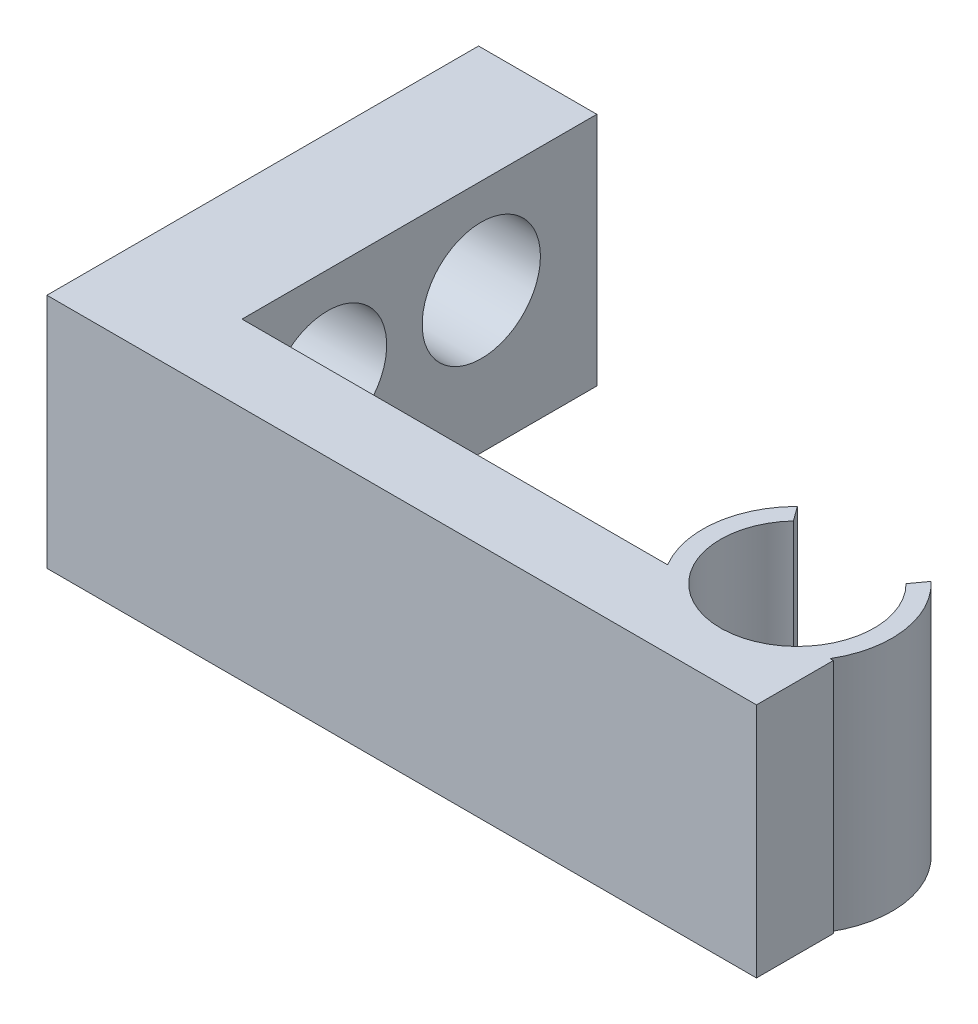
ISO-10303-21;
HEADER;
FILE_DESCRIPTION(('STEP AP214'),'2;1');
FILE_NAME('part.step','',(''),(''),'','','');
FILE_SCHEMA(('AUTOMOTIVE_DESIGN { 1 0 10303 214 1 1 1 1 }'));
ENDSEC;
DATA;
#1=APPLICATION_CONTEXT('core data for automotive mechanical design processes');
#2=APPLICATION_PROTOCOL_DEFINITION('international standard','automotive_design',2000,#1);
#3=PRODUCT_CONTEXT('',#1,'mechanical');
#4=PRODUCT('Part','Part','',(#3));
#5=PRODUCT_RELATED_PRODUCT_CATEGORY('part','',(#4));
#6=PRODUCT_DEFINITION_FORMATION('','',#4);
#7=PRODUCT_DEFINITION_CONTEXT('part definition',#1,'design');
#8=PRODUCT_DEFINITION('design','',#6,#7);
#9=PRODUCT_DEFINITION_SHAPE('','',#8);
#10=(LENGTH_UNIT() NAMED_UNIT(*) SI_UNIT(.MILLI.,.METRE.));
#11=(NAMED_UNIT(*) PLANE_ANGLE_UNIT() SI_UNIT($,.RADIAN.));
#12=(NAMED_UNIT(*) SI_UNIT($,.STERADIAN.) SOLID_ANGLE_UNIT());
#13=UNCERTAINTY_MEASURE_WITH_UNIT(LENGTH_MEASURE(1.E-05),#10,'distance_accuracy_value','');
#14=(GEOMETRIC_REPRESENTATION_CONTEXT(3) GLOBAL_UNCERTAINTY_ASSIGNED_CONTEXT((#13)) GLOBAL_UNIT_ASSIGNED_CONTEXT((#10,
#11,#12)) REPRESENTATION_CONTEXT('',''));
#15=CARTESIAN_POINT('',(0.,0.,0.));
#16=DIRECTION('',(0.,0.,1.));
#17=DIRECTION('',(1.,0.,0.));
#18=AXIS2_PLACEMENT_3D('',#15,#16,#17);
#19=CARTESIAN_POINT('',(-35.,11.9914042805089,-23.4817271345462));
#20=DIRECTION('',(1.,0.,0.));
#21=DIRECTION('',(0.,0.,-1.));
#22=AXIS2_PLACEMENT_3D('',#19,#20,#21);
#23=CYLINDRICAL_SURFACE('',#22,2.5);
#24=CARTESIAN_POINT('',(-30.,11.9914042805089,-23.4817271345462));
#25=DIRECTION('',(-1.,0.,0.));
#26=DIRECTION('',(0.,0.,1.));
#27=AXIS2_PLACEMENT_3D('',#24,#25,#26);
#28=CIRCLE('',#27,2.5);
#29=CARTESIAN_POINT('',(-30.,11.9914042805089,-20.9817271345462));
#30=VERTEX_POINT('',#29);
#31=EDGE_CURVE('E233',#30,#30,#28,.T.);
#32=ORIENTED_EDGE('',*,*,#31,.T.);
#33=EDGE_LOOP('',(#32));
#34=FACE_BOUND('',#33,.T.);
#35=CARTESIAN_POINT('',(-29.,11.9914042805089,-23.4817271345462));
#36=DIRECTION('',(1.,0.,0.));
#37=DIRECTION('',(0.,0.,-1.));
#38=AXIS2_PLACEMENT_3D('',#35,#36,#37);
#39=CIRCLE('',#38,2.5);
#40=CARTESIAN_POINT('',(-29.,11.9914042805089,-25.9817271345462));
#41=VERTEX_POINT('',#40);
#42=EDGE_CURVE('E39',#41,#41,#39,.F.);
#43=ORIENTED_EDGE('',*,*,#42,.F.);
#44=EDGE_LOOP('',(#43));
#45=FACE_BOUND('',#44,.T.);
#46=ADVANCED_FACE('F35',(#34,#45),#23,.F.);
#47=CARTESIAN_POINT('',(-30.,20.,0.));
#48=DIRECTION('',(-1.,0.,0.));
#49=DIRECTION('',(0.,0.,1.));
#50=AXIS2_PLACEMENT_3D('',#47,#48,#49);
#51=PLANE('',#50);
#52=DIRECTION('',(0.,0.,-1.));
#53=VECTOR('',#52,1.);
#54=CARTESIAN_POINT('',(-30.,0.,0.));
#55=LINE('',#54,#53);
#56=CARTESIAN_POINT('',(-30.,0.,3.25));
#57=VERTEX_POINT('',#56);
#58=CARTESIAN_POINT('',(-30.,0.,-3.25));
#59=VERTEX_POINT('',#58);
#60=EDGE_CURVE('E195',#57,#59,#55,.T.);
#61=ORIENTED_EDGE('',*,*,#60,.F.);
#62=DIRECTION('',(0.,-1.,0.));
#63=VECTOR('',#62,1.);
#64=CARTESIAN_POINT('',(-30.,20.,3.25));
#65=LINE('',#64,#63);
#66=CARTESIAN_POINT('',(-30.,20.,3.25));
#67=VERTEX_POINT('',#66);
#68=EDGE_CURVE('E221',#67,#57,#65,.T.);
#69=ORIENTED_EDGE('',*,*,#68,.F.);
#70=DIRECTION('',(0.,0.,-1.));
#71=VECTOR('',#70,1.);
#72=CARTESIAN_POINT('',(-30.,20.,0.));
#73=LINE('',#72,#71);
#74=CARTESIAN_POINT('',(-30.,20.,-33.25));
#75=VERTEX_POINT('',#74);
#76=EDGE_CURVE('E173',#67,#75,#73,.T.);
#77=ORIENTED_EDGE('',*,*,#76,.T.);
#78=DIRECTION('',(0.,1.,0.));
#79=VECTOR('',#78,1.);
#80=CARTESIAN_POINT('',(-30.,20.,-33.25));
#81=LINE('',#80,#79);
#82=CARTESIAN_POINT('',(-30.,0.0998906760250207,-33.25));
#83=VERTEX_POINT('',#82);
#84=EDGE_CURVE('E140',#83,#75,#81,.T.);
#85=ORIENTED_EDGE('',*,*,#84,.F.);
#86=DIRECTION('',(0.,0.,1.));
#87=VECTOR('',#86,1.);
#88=CARTESIAN_POINT('',(-30.,0.0998906760250207,-33.25));
#89=LINE('',#88,#87);
#90=CARTESIAN_POINT('',(-30.,0.0998906760250225,-3.25));
#91=VERTEX_POINT('',#90);
#92=EDGE_CURVE('E136',#83,#91,#89,.T.);
#93=ORIENTED_EDGE('',*,*,#92,.T.);
#94=DIRECTION('',(0.,-1.,0.));
#95=VECTOR('',#94,1.);
#96=CARTESIAN_POINT('',(-30.,20.,-3.25));
#97=LINE('',#96,#95);
#98=EDGE_CURVE('E57',#91,#59,#97,.T.);
#99=ORIENTED_EDGE('',*,*,#98,.T.);
#100=EDGE_LOOP('',(#61,#69,#77,#85,#93,#99));
#101=FACE_BOUND('',#100,.T.);
#102=ORIENTED_EDGE('',*,*,#31,.F.);
#103=EDGE_LOOP('',(#102));
#104=FACE_BOUND('',#103,.T.);
#105=CARTESIAN_POINT('',(-30.,11.9914042805089,-10.4817271345462));
#106=DIRECTION('',(-1.,0.,0.));
#107=DIRECTION('',(0.,0.,1.));
#108=AXIS2_PLACEMENT_3D('',#105,#106,#107);
#109=CIRCLE('',#108,2.5);
#110=CARTESIAN_POINT('',(-30.,11.9914042805089,-7.98172713454624));
#111=VERTEX_POINT('',#110);
#112=EDGE_CURVE('E250',#111,#111,#109,.F.);
#113=ORIENTED_EDGE('',*,*,#112,.T.);
#114=EDGE_LOOP('',(#113));
#115=FACE_BOUND('',#114,.T.);
#116=ADVANCED_FACE('F271',(#101,#104,#115),#51,.T.);
#117=CARTESIAN_POINT('',(-20.,20.,-33.25));
#118=DIRECTION('',(-1.,0.,0.));
#119=DIRECTION('',(0.,0.,1.));
#120=AXIS2_PLACEMENT_3D('',#117,#118,#119);
#121=PLANE('',#120);
#122=CARTESIAN_POINT('',(-20.,11.9914042805089,-23.4817271345462));
#123=DIRECTION('',(1.,0.,0.));
#124=DIRECTION('',(0.,0.,-1.));
#125=AXIS2_PLACEMENT_3D('',#122,#123,#124);
#126=CIRCLE('',#125,5.);
#127=CARTESIAN_POINT('',(-20.,11.9914042805089,-28.4817271345462));
#128=VERTEX_POINT('',#127);
#129=EDGE_CURVE('E235',#128,#128,#126,.T.);
#130=ORIENTED_EDGE('',*,*,#129,.F.);
#131=EDGE_LOOP('',(#130));
#132=FACE_BOUND('',#131,.T.);
#133=CARTESIAN_POINT('',(-20.,11.9914042805089,-10.4817271345462));
#134=DIRECTION('',(1.,0.,0.));
#135=DIRECTION('',(0.,0.,1.));
#136=AXIS2_PLACEMENT_3D('',#133,#134,#135);
#137=CIRCLE('',#136,5.);
#138=CARTESIAN_POINT('',(-20.,11.9914042805089,-5.48172713454624));
#139=VERTEX_POINT('',#138);
#140=EDGE_CURVE('E245',#139,#139,#137,.T.);
#141=ORIENTED_EDGE('',*,*,#140,.F.);
#142=EDGE_LOOP('',(#141));
#143=FACE_BOUND('',#142,.T.);
#144=DIRECTION('',(0.,-1.,0.));
#145=VECTOR('',#144,1.);
#146=CARTESIAN_POINT('',(-20.,20.,-3.25));
#147=LINE('',#146,#145);
#148=CARTESIAN_POINT('',(-20.,20.,-3.25));
#149=VERTEX_POINT('',#148);
#150=CARTESIAN_POINT('',(-20.,0.0998906760250181,-3.25));
#151=VERTEX_POINT('',#150);
#152=EDGE_CURVE('E152',#149,#151,#147,.T.);
#153=ORIENTED_EDGE('',*,*,#152,.T.);
#154=DIRECTION('',(0.,0.,1.));
#155=VECTOR('',#154,1.);
#156=CARTESIAN_POINT('',(-20.,0.0998906760250195,-33.25));
#157=LINE('',#156,#155);
#158=CARTESIAN_POINT('',(-20.,0.0998906760250195,-33.25));
#159=VERTEX_POINT('',#158);
#160=EDGE_CURVE('E133',#159,#151,#157,.T.);
#161=ORIENTED_EDGE('',*,*,#160,.F.);
#162=DIRECTION('',(0.,-1.,0.));
#163=VECTOR('',#162,1.);
#164=CARTESIAN_POINT('',(-20.,20.,-33.25));
#165=LINE('',#164,#163);
#166=CARTESIAN_POINT('',(-20.,20.,-33.25));
#167=VERTEX_POINT('',#166);
#168=EDGE_CURVE('E141',#167,#159,#165,.T.);
#169=ORIENTED_EDGE('',*,*,#168,.F.);
#170=DIRECTION('',(0.,0.,1.));
#171=VECTOR('',#170,1.);
#172=CARTESIAN_POINT('',(-20.,20.,-33.25));
#173=LINE('',#172,#171);
#174=EDGE_CURVE('E158',#167,#149,#173,.T.);
#175=ORIENTED_EDGE('',*,*,#174,.T.);
#176=EDGE_LOOP('',(#153,#161,#169,#175));
#177=FACE_BOUND('',#176,.T.);
#178=ADVANCED_FACE('F151',(#132,#143,#177),#121,.F.);
#179=CARTESIAN_POINT('',(0.,20.,-3.25));
#180=DIRECTION('',(0.,0.,-1.));
#181=DIRECTION('',(-1.,0.,0.));
#182=AXIS2_PLACEMENT_3D('',#179,#180,#181);
#183=PLANE('',#182);
#184=DIRECTION('',(-1.,0.,0.));
#185=VECTOR('',#184,1.);
#186=CARTESIAN_POINT('',(-20.,0.0998906760250195,-3.25));
#187=LINE('',#186,#185);
#188=EDGE_CURVE('E52',#151,#91,#187,.T.);
#189=ORIENTED_EDGE('',*,*,#188,.F.);
#190=ORIENTED_EDGE('',*,*,#152,.F.);
#191=DIRECTION('',(1.,0.,0.));
#192=VECTOR('',#191,1.);
#193=CARTESIAN_POINT('',(0.,20.,-3.25));
#194=LINE('',#193,#192);
#195=CARTESIAN_POINT('',(15.9857777213072,20.,-3.25));
#196=VERTEX_POINT('',#195);
#197=EDGE_CURVE('E171',#149,#196,#194,.T.);
#198=ORIENTED_EDGE('',*,*,#197,.T.);
#199=DIRECTION('',(0.,-1.,0.));
#200=VECTOR('',#199,1.);
#201=CARTESIAN_POINT('',(15.9857777213072,20.,-3.25));
#202=LINE('',#201,#200);
#203=CARTESIAN_POINT('',(15.9857777213072,0.,-3.25));
#204=VERTEX_POINT('',#203);
#205=EDGE_CURVE('E224',#196,#204,#202,.T.);
#206=ORIENTED_EDGE('',*,*,#205,.T.);
#207=DIRECTION('',(1.,0.,0.));
#208=VECTOR('',#207,1.);
#209=CARTESIAN_POINT('',(0.,0.,-3.25));
#210=LINE('',#209,#208);
#211=EDGE_CURVE('E192',#59,#204,#210,.T.);
#212=ORIENTED_EDGE('',*,*,#211,.F.);
#213=ORIENTED_EDGE('',*,*,#98,.F.);
#214=EDGE_LOOP('',(#189,#190,#198,#206,#212,#213));
#215=FACE_BOUND('',#214,.T.);
#216=ADVANCED_FACE('F262',(#215),#183,.T.);
#217=CARTESIAN_POINT('',(22.8521315138547,20.,-7.35526315789474));
#218=DIRECTION('',(0.,-1.,0.));
#219=DIRECTION('',(0.,0.,-1.));
#220=AXIS2_PLACEMENT_3D('',#217,#218,#219);
#221=CYLINDRICAL_SURFACE('',#220,6.5);
#222=CARTESIAN_POINT('',(22.8521315138547,0.,-7.35526315789474));
#223=DIRECTION('',(0.,1.,0.));
#224=DIRECTION('',(0.,0.,1.));
#225=AXIS2_PLACEMENT_3D('',#222,#223,#224);
#226=CIRCLE('',#225,6.5);
#227=CARTESIAN_POINT('',(18.0905451381988,0.,-11.7798868918599));
#228=VERTEX_POINT('',#227);
#229=CARTESIAN_POINT('',(27.4483255915673,0.,-11.9514572356073));
#230=VERTEX_POINT('',#229);
#231=EDGE_CURVE('E153',#228,#230,#226,.T.);
#232=ORIENTED_EDGE('',*,*,#231,.F.);
#233=DIRECTION('',(0.,-1.,0.));
#234=VECTOR('',#233,1.);
#235=CARTESIAN_POINT('',(18.0905451381988,20.,-11.7798868918599));
#236=LINE('',#235,#234);
#237=CARTESIAN_POINT('',(18.0905451381988,20.,-11.7798868918599));
#238=VERTEX_POINT('',#237);
#239=EDGE_CURVE('E11',#238,#228,#236,.T.);
#240=ORIENTED_EDGE('',*,*,#239,.F.);
#241=CARTESIAN_POINT('',(22.8521315138547,20.,-7.35526315789474));
#242=DIRECTION('',(0.,1.,0.));
#243=DIRECTION('',(0.,0.,1.));
#244=AXIS2_PLACEMENT_3D('',#241,#242,#243);
#245=CIRCLE('',#244,6.5);
#246=CARTESIAN_POINT('',(27.4483255915673,20.,-11.9514572356073));
#247=VERTEX_POINT('',#246);
#248=EDGE_CURVE('E162',#238,#247,#245,.T.);
#249=ORIENTED_EDGE('',*,*,#248,.T.);
#250=DIRECTION('',(0.,-1.,0.));
#251=VECTOR('',#250,1.);
#252=CARTESIAN_POINT('',(27.4483255915673,20.,-11.9514572356073));
#253=LINE('',#252,#251);
#254=EDGE_CURVE('E186',#247,#230,#253,.T.);
#255=ORIENTED_EDGE('',*,*,#254,.T.);
#256=EDGE_LOOP('',(#232,#240,#249,#255));
#257=FACE_BOUND('',#256,.T.);
#258=ADVANCED_FACE('F37',(#257),#221,.F.);
#259=CARTESIAN_POINT('',(17.4420846065663,20.,-12.6724162437381));
#260=DIRECTION('',(-0.809016994374946,0.,0.587785252292475));
#261=DIRECTION('',(0.587785252292475,0.,0.809016994374946));
#262=AXIS2_PLACEMENT_3D('',#259,#260,#261);
#263=PLANE('',#262);
#264=DIRECTION('',(-0.587785252292475,0.,-0.809016994374946));
#265=VECTOR('',#264,1.);
#266=CARTESIAN_POINT('',(17.4420846065663,0.,-12.6724162437381));
#267=LINE('',#266,#265);
#268=CARTESIAN_POINT('',(17.1952772643623,0.,-13.0121174073871));
#269=VERTEX_POINT('',#268);
#270=EDGE_CURVE('E156',#228,#269,#267,.T.);
#271=ORIENTED_EDGE('',*,*,#270,.T.);
#272=DIRECTION('',(0.,-1.,0.));
#273=VECTOR('',#272,1.);
#274=CARTESIAN_POINT('',(17.1952772643623,20.,-13.0121174073871));
#275=LINE('',#274,#273);
#276=CARTESIAN_POINT('',(17.1952772643623,20.,-13.0121174073871));
#277=VERTEX_POINT('',#276);
#278=EDGE_CURVE('E44',#277,#269,#275,.T.);
#279=ORIENTED_EDGE('',*,*,#278,.F.);
#280=DIRECTION('',(-0.587785252292475,0.,-0.809016994374946));
#281=VECTOR('',#280,1.);
#282=CARTESIAN_POINT('',(17.4420846065663,20.,-12.6724162437381));
#283=LINE('',#282,#281);
#284=EDGE_CURVE('E165',#238,#277,#283,.T.);
#285=ORIENTED_EDGE('',*,*,#284,.F.);
#286=ORIENTED_EDGE('',*,*,#239,.T.);
#287=EDGE_LOOP('',(#271,#279,#285,#286));
#288=FACE_BOUND('',#287,.T.);
#289=ADVANCED_FACE('F269',(#288),#263,.F.);
#290=CARTESIAN_POINT('',(22.8521315138547,20.,-7.35526315789474));
#291=DIRECTION('',(0.,-1.,0.));
#292=DIRECTION('',(0.,0.,-1.));
#293=AXIS2_PLACEMENT_3D('',#290,#291,#292);
#294=CYLINDRICAL_SURFACE('',#293,8.);
#295=CARTESIAN_POINT('',(22.8521315138547,0.,-7.35526315789474));
#296=DIRECTION('',(0.,1.,0.));
#297=DIRECTION('',(0.,0.,1.));
#298=AXIS2_PLACEMENT_3D('',#295,#296,#297);
#299=CIRCLE('',#298,8.);
#300=EDGE_CURVE('E189',#269,#204,#299,.T.);
#301=ORIENTED_EDGE('',*,*,#300,.T.);
#302=ORIENTED_EDGE('',*,*,#205,.F.);
#303=CARTESIAN_POINT('',(22.8521315138547,20.,-7.35526315789474));
#304=DIRECTION('',(0.,1.,0.));
#305=DIRECTION('',(0.,0.,1.));
#306=AXIS2_PLACEMENT_3D('',#303,#304,#305);
#307=CIRCLE('',#306,8.);
#308=EDGE_CURVE('E168',#277,#196,#307,.T.);
#309=ORIENTED_EDGE('',*,*,#308,.F.);
#310=ORIENTED_EDGE('',*,*,#278,.T.);
#311=EDGE_LOOP('',(#301,#302,#309,#310));
#312=FACE_BOUND('',#311,.T.);
#313=ADVANCED_FACE('F316',(#312),#294,.T.);
#314=CARTESIAN_POINT('',(0.,20.,3.25));
#315=DIRECTION('',(0.,0.,1.));
#316=DIRECTION('',(1.,0.,0.));
#317=AXIS2_PLACEMENT_3D('',#314,#315,#316);
#318=PLANE('',#317);
#319=DIRECTION('',(-1.,0.,0.));
#320=VECTOR('',#319,1.);
#321=CARTESIAN_POINT('',(0.,0.,3.25));
#322=LINE('',#321,#320);
#323=CARTESIAN_POINT('',(30.,0.,3.25));
#324=VERTEX_POINT('',#323);
#325=EDGE_CURVE('E198',#324,#57,#322,.T.);
#326=ORIENTED_EDGE('',*,*,#325,.F.);
#327=DIRECTION('',(0.,-1.,0.));
#328=VECTOR('',#327,1.);
#329=CARTESIAN_POINT('',(30.,20.,3.25));
#330=LINE('',#329,#328);
#331=CARTESIAN_POINT('',(30.,20.,3.25));
#332=VERTEX_POINT('',#331);
#333=EDGE_CURVE('E219',#332,#324,#330,.T.);
#334=ORIENTED_EDGE('',*,*,#333,.F.);
#335=DIRECTION('',(-1.,0.,0.));
#336=VECTOR('',#335,1.);
#337=CARTESIAN_POINT('',(0.,20.,3.25));
#338=LINE('',#337,#336);
#339=EDGE_CURVE('E175',#332,#67,#338,.T.);
#340=ORIENTED_EDGE('',*,*,#339,.T.);
#341=ORIENTED_EDGE('',*,*,#68,.T.);
#342=EDGE_LOOP('',(#326,#334,#340,#341));
#343=FACE_BOUND('',#342,.T.);
#344=ADVANCED_FACE('F313',(#343),#318,.T.);
#345=CARTESIAN_POINT('',(30.,20.,0.));
#346=DIRECTION('',(-1.,0.,0.));
#347=DIRECTION('',(0.,0.,1.));
#348=AXIS2_PLACEMENT_3D('',#345,#346,#347);
#349=PLANE('',#348);
#350=DIRECTION('',(0.,0.,-1.));
#351=VECTOR('',#350,1.);
#352=CARTESIAN_POINT('',(30.,0.,0.));
#353=LINE('',#352,#351);
#354=CARTESIAN_POINT('',(30.,0.,-3.25));
#355=VERTEX_POINT('',#354);
#356=EDGE_CURVE('E201',#324,#355,#353,.T.);
#357=ORIENTED_EDGE('',*,*,#356,.T.);
#358=DIRECTION('',(0.,-1.,0.));
#359=VECTOR('',#358,1.);
#360=CARTESIAN_POINT('',(30.,20.,-3.25));
#361=LINE('',#360,#359);
#362=CARTESIAN_POINT('',(30.,20.,-3.25));
#363=VERTEX_POINT('',#362);
#364=EDGE_CURVE('E216',#363,#355,#361,.T.);
#365=ORIENTED_EDGE('',*,*,#364,.F.);
#366=DIRECTION('',(0.,0.,-1.));
#367=VECTOR('',#366,1.);
#368=CARTESIAN_POINT('',(30.,20.,0.));
#369=LINE('',#368,#367);
#370=EDGE_CURVE('E178',#332,#363,#369,.T.);
#371=ORIENTED_EDGE('',*,*,#370,.F.);
#372=ORIENTED_EDGE('',*,*,#333,.T.);
#373=EDGE_LOOP('',(#357,#365,#371,#372));
#374=FACE_BOUND('',#373,.T.);
#375=ADVANCED_FACE('F309',(#374),#349,.F.);
#376=CARTESIAN_POINT('',(0.,20.,-3.24999999999999));
#377=DIRECTION('',(0.,0.,1.));
#378=DIRECTION('',(1.,0.,0.));
#379=AXIS2_PLACEMENT_3D('',#376,#377,#378);
#380=PLANE('',#379);
#381=DIRECTION('',(-1.,0.,0.));
#382=VECTOR('',#381,1.);
#383=CARTESIAN_POINT('',(0.,0.,-3.24999999999999));
#384=LINE('',#383,#382);
#385=CARTESIAN_POINT('',(29.7184853064022,0.,-3.25));
#386=VERTEX_POINT('',#385);
#387=EDGE_CURVE('E203',#355,#386,#384,.T.);
#388=ORIENTED_EDGE('',*,*,#387,.T.);
#389=DIRECTION('',(0.,-1.,0.));
#390=VECTOR('',#389,1.);
#391=CARTESIAN_POINT('',(29.7184853064022,20.,-3.25));
#392=LINE('',#391,#390);
#393=CARTESIAN_POINT('',(29.7184853064022,20.,-3.25));
#394=VERTEX_POINT('',#393);
#395=EDGE_CURVE('E213',#394,#386,#392,.T.);
#396=ORIENTED_EDGE('',*,*,#395,.F.);
#397=DIRECTION('',(-1.,0.,0.));
#398=VECTOR('',#397,1.);
#399=CARTESIAN_POINT('',(0.,20.,-3.24999999999999));
#400=LINE('',#399,#398);
#401=EDGE_CURVE('E180',#363,#394,#400,.T.);
#402=ORIENTED_EDGE('',*,*,#401,.F.);
#403=ORIENTED_EDGE('',*,*,#364,.T.);
#404=EDGE_LOOP('',(#388,#396,#402,#403));
#405=FACE_BOUND('',#404,.T.);
#406=ADVANCED_FACE('F305',(#405),#380,.F.);
#407=CARTESIAN_POINT('',(22.8521315138547,20.,-7.35526315789474));
#408=DIRECTION('',(0.,-1.,0.));
#409=DIRECTION('',(0.,0.,-1.));
#410=AXIS2_PLACEMENT_3D('',#407,#408,#409);
#411=CYLINDRICAL_SURFACE('',#410,8.);
#412=CARTESIAN_POINT('',(22.8521315138547,0.,-7.35526315789474));
#413=DIRECTION('',(0.,1.,0.));
#414=DIRECTION('',(0.,0.,1.));
#415=AXIS2_PLACEMENT_3D('',#412,#413,#414);
#416=CIRCLE('',#415,8.);
#417=CARTESIAN_POINT('',(28.3389036987087,0.,-13.1772328410443));
#418=VERTEX_POINT('',#417);
#419=EDGE_CURVE('E205',#386,#418,#416,.T.);
#420=ORIENTED_EDGE('',*,*,#419,.T.);
#421=DIRECTION('',(0.,-1.,0.));
#422=VECTOR('',#421,1.);
#423=CARTESIAN_POINT('',(28.3389036987087,20.,-13.1772328410443));
#424=LINE('',#423,#422);
#425=CARTESIAN_POINT('',(28.3389036987087,20.,-13.1772328410443));
#426=VERTEX_POINT('',#425);
#427=EDGE_CURVE('E211',#426,#418,#424,.T.);
#428=ORIENTED_EDGE('',*,*,#427,.F.);
#429=CARTESIAN_POINT('',(22.8521315138547,20.,-7.35526315789474));
#430=DIRECTION('',(0.,1.,0.));
#431=DIRECTION('',(0.,0.,1.));
#432=AXIS2_PLACEMENT_3D('',#429,#430,#431);
#433=CIRCLE('',#432,8.);
#434=EDGE_CURVE('E182',#394,#426,#433,.T.);
#435=ORIENTED_EDGE('',*,*,#434,.F.);
#436=ORIENTED_EDGE('',*,*,#395,.T.);
#437=EDGE_LOOP('',(#420,#428,#435,#436));
#438=FACE_BOUND('',#437,.T.);
#439=ADVANCED_FACE('F301',(#438),#411,.T.);
#440=CARTESIAN_POINT('',(12.2819066916757,20.,8.92332753649595));
#441=DIRECTION('',(-0.809016994374951,0.,-0.587785252292469));
#442=DIRECTION('',(-0.587785252292469,0.,0.809016994374951));
#443=AXIS2_PLACEMENT_3D('',#440,#441,#442);
#444=PLANE('',#443);
#445=DIRECTION('',(0.587785252292469,0.,-0.809016994374951));
#446=VECTOR('',#445,1.);
#447=CARTESIAN_POINT('',(12.2819066916757,0.,8.92332753649595));
#448=LINE('',#447,#446);
#449=EDGE_CURVE('E166',#230,#418,#448,.T.);
#450=ORIENTED_EDGE('',*,*,#449,.F.);
#451=ORIENTED_EDGE('',*,*,#254,.F.);
#452=DIRECTION('',(0.587785252292469,0.,-0.809016994374951));
#453=VECTOR('',#452,1.);
#454=CARTESIAN_POINT('',(12.2819066916757,20.,8.92332753649595));
#455=LINE('',#454,#453);
#456=EDGE_CURVE('E184',#247,#426,#455,.T.);
#457=ORIENTED_EDGE('',*,*,#456,.T.);
#458=ORIENTED_EDGE('',*,*,#427,.T.);
#459=EDGE_LOOP('',(#450,#451,#457,#458));
#460=FACE_BOUND('',#459,.T.);
#461=ADVANCED_FACE('F295',(#460),#444,.T.);
#462=CARTESIAN_POINT('',(0.,20.,0.));
#463=DIRECTION('',(0.,1.,0.));
#464=DIRECTION('',(0.,0.,1.));
#465=AXIS2_PLACEMENT_3D('',#462,#463,#464);
#466=PLANE('',#465);
#467=ORIENTED_EDGE('',*,*,#248,.F.);
#468=ORIENTED_EDGE('',*,*,#284,.T.);
#469=ORIENTED_EDGE('',*,*,#308,.T.);
#470=ORIENTED_EDGE('',*,*,#197,.F.);
#471=ORIENTED_EDGE('',*,*,#174,.F.);
#472=DIRECTION('',(1.,0.,0.));
#473=VECTOR('',#472,1.);
#474=CARTESIAN_POINT('',(-20.,20.,-33.25));
#475=LINE('',#474,#473);
#476=EDGE_CURVE('E146',#75,#167,#475,.T.);
#477=ORIENTED_EDGE('',*,*,#476,.F.);
#478=ORIENTED_EDGE('',*,*,#76,.F.);
#479=ORIENTED_EDGE('',*,*,#339,.F.);
#480=ORIENTED_EDGE('',*,*,#370,.T.);
#481=ORIENTED_EDGE('',*,*,#401,.T.);
#482=ORIENTED_EDGE('',*,*,#434,.T.);
#483=ORIENTED_EDGE('',*,*,#456,.F.);
#484=EDGE_LOOP('',(#467,#468,#469,#470,#471,#477,#478,#479,#480,#481,#482,#483));
#485=FACE_BOUND('',#484,.T.);
#486=ADVANCED_FACE('F258',(#485),#466,.T.);
#487=CARTESIAN_POINT('',(0.,0.,0.));
#488=DIRECTION('',(0.,1.,0.));
#489=DIRECTION('',(0.,0.,1.));
#490=AXIS2_PLACEMENT_3D('',#487,#488,#489);
#491=PLANE('',#490);
#492=ORIENTED_EDGE('',*,*,#231,.T.);
#493=ORIENTED_EDGE('',*,*,#449,.T.);
#494=ORIENTED_EDGE('',*,*,#419,.F.);
#495=ORIENTED_EDGE('',*,*,#387,.F.);
#496=ORIENTED_EDGE('',*,*,#356,.F.);
#497=ORIENTED_EDGE('',*,*,#325,.T.);
#498=ORIENTED_EDGE('',*,*,#60,.T.);
#499=ORIENTED_EDGE('',*,*,#211,.T.);
#500=ORIENTED_EDGE('',*,*,#300,.F.);
#501=ORIENTED_EDGE('',*,*,#270,.F.);
#502=EDGE_LOOP('',(#492,#493,#494,#495,#496,#497,#498,#499,#500,#501));
#503=FACE_BOUND('',#502,.T.);
#504=ADVANCED_FACE('F291',(#503),#491,.F.);
#505=CARTESIAN_POINT('',(-20.,0.0998906760250195,-33.25));
#506=DIRECTION('',(0.,1.,0.));
#507=DIRECTION('',(-1.,0.,0.));
#508=AXIS2_PLACEMENT_3D('',#505,#506,#507);
#509=PLANE('',#508);
#510=ORIENTED_EDGE('',*,*,#188,.T.);
#511=ORIENTED_EDGE('',*,*,#92,.F.);
#512=DIRECTION('',(-1.,0.,0.));
#513=VECTOR('',#512,1.);
#514=CARTESIAN_POINT('',(-20.,0.0998906760250195,-33.25));
#515=LINE('',#514,#513);
#516=EDGE_CURVE('E129',#159,#83,#515,.T.);
#517=ORIENTED_EDGE('',*,*,#516,.F.);
#518=ORIENTED_EDGE('',*,*,#160,.T.);
#519=EDGE_LOOP('',(#510,#511,#517,#518));
#520=FACE_BOUND('',#519,.T.);
#521=ADVANCED_FACE('F131',(#520),#509,.F.);
#522=CARTESIAN_POINT('',(0.,0.,-33.25));
#523=DIRECTION('',(0.,0.,-1.));
#524=DIRECTION('',(-1.,0.,0.));
#525=AXIS2_PLACEMENT_3D('',#522,#523,#524);
#526=PLANE('',#525);
#527=ORIENTED_EDGE('',*,*,#168,.T.);
#528=ORIENTED_EDGE('',*,*,#516,.T.);
#529=ORIENTED_EDGE('',*,*,#84,.T.);
#530=ORIENTED_EDGE('',*,*,#476,.T.);
#531=EDGE_LOOP('',(#527,#528,#529,#530));
#532=FACE_BOUND('',#531,.T.);
#533=ADVANCED_FACE('F144',(#532),#526,.T.);
#534=CARTESIAN_POINT('',(-35.,11.9914042805089,-10.4817271345462));
#535=DIRECTION('',(1.,0.,0.));
#536=DIRECTION('',(0.,0.,-1.));
#537=AXIS2_PLACEMENT_3D('',#534,#535,#536);
#538=CYLINDRICAL_SURFACE('',#537,2.5);
#539=CARTESIAN_POINT('',(-29.,11.9914042805089,-10.4817271345462));
#540=DIRECTION('',(-1.,0.,0.));
#541=DIRECTION('',(0.,0.,1.));
#542=AXIS2_PLACEMENT_3D('',#539,#540,#541);
#543=CIRCLE('',#542,2.5);
#544=CARTESIAN_POINT('',(-29.,11.9914042805089,-7.98172713454624));
#545=VERTEX_POINT('',#544);
#546=EDGE_CURVE('E227',#545,#545,#543,.T.);
#547=ORIENTED_EDGE('',*,*,#546,.F.);
#548=EDGE_LOOP('',(#547));
#549=FACE_BOUND('',#548,.T.);
#550=ORIENTED_EDGE('',*,*,#112,.F.);
#551=EDGE_LOOP('',(#550));
#552=FACE_BOUND('',#551,.T.);
#553=ADVANCED_FACE('F286',(#549,#552),#538,.F.);
#554=CARTESIAN_POINT('',(-29.,11.9914042805089,-10.4817271345462));
#555=DIRECTION('',(1.,0.,0.));
#556=DIRECTION('',(0.,0.,-1.));
#557=AXIS2_PLACEMENT_3D('',#554,#555,#556);
#558=CYLINDRICAL_SURFACE('',#557,5.);
#559=CARTESIAN_POINT('',(-29.,11.9914042805089,-10.4817271345462));
#560=DIRECTION('',(1.,0.,0.));
#561=DIRECTION('',(0.,0.,1.));
#562=AXIS2_PLACEMENT_3D('',#559,#560,#561);
#563=CIRCLE('',#562,5.);
#564=CARTESIAN_POINT('',(-29.,11.9914042805089,-5.48172713454624));
#565=VERTEX_POINT('',#564);
#566=EDGE_CURVE('E240',#565,#565,#563,.T.);
#567=ORIENTED_EDGE('',*,*,#566,.F.);
#568=EDGE_LOOP('',(#567));
#569=FACE_BOUND('',#568,.T.);
#570=ORIENTED_EDGE('',*,*,#140,.T.);
#571=EDGE_LOOP('',(#570));
#572=FACE_BOUND('',#571,.T.);
#573=ADVANCED_FACE('F440',(#569,#572),#558,.F.);
#574=CARTESIAN_POINT('',(-29.,11.9914042805089,-10.4817271345462));
#575=DIRECTION('',(-1.,0.,0.));
#576=DIRECTION('',(0.,0.,1.));
#577=AXIS2_PLACEMENT_3D('',#574,#575,#576);
#578=PLANE('',#577);
#579=ORIENTED_EDGE('',*,*,#546,.T.);
#580=EDGE_LOOP('',(#579));
#581=FACE_BOUND('',#580,.T.);
#582=ORIENTED_EDGE('',*,*,#566,.T.);
#583=EDGE_LOOP('',(#582));
#584=FACE_BOUND('',#583,.T.);
#585=ADVANCED_FACE('F448',(#581,#584),#578,.F.);
#586=CARTESIAN_POINT('',(-29.,11.9914042805089,-23.4817271345462));
#587=DIRECTION('',(1.,0.,0.));
#588=DIRECTION('',(0.,0.,-1.));
#589=AXIS2_PLACEMENT_3D('',#586,#587,#588);
#590=PLANE('',#589);
#591=CARTESIAN_POINT('',(-29.,11.9914042805089,-23.4817271345462));
#592=DIRECTION('',(1.,0.,0.));
#593=DIRECTION('',(0.,0.,-1.));
#594=AXIS2_PLACEMENT_3D('',#591,#592,#593);
#595=CIRCLE('',#594,5.);
#596=CARTESIAN_POINT('',(-29.,11.9914042805089,-28.4817271345462));
#597=VERTEX_POINT('',#596);
#598=EDGE_CURVE('E229',#597,#597,#595,.T.);
#599=ORIENTED_EDGE('',*,*,#598,.T.);
#600=EDGE_LOOP('',(#599));
#601=FACE_BOUND('',#600,.T.);
#602=ORIENTED_EDGE('',*,*,#42,.T.);
#603=EDGE_LOOP('',(#602));
#604=FACE_BOUND('',#603,.T.);
#605=ADVANCED_FACE('F457',(#601,#604),#590,.T.);
#606=CARTESIAN_POINT('',(-29.,11.9914042805089,-23.4817271345462));
#607=DIRECTION('',(1.,0.,0.));
#608=DIRECTION('',(0.,0.,-1.));
#609=AXIS2_PLACEMENT_3D('',#606,#607,#608);
#610=CYLINDRICAL_SURFACE('',#609,5.);
#611=ORIENTED_EDGE('',*,*,#598,.F.);
#612=EDGE_LOOP('',(#611));
#613=FACE_BOUND('',#612,.T.);
#614=ORIENTED_EDGE('',*,*,#129,.T.);
#615=EDGE_LOOP('',(#614));
#616=FACE_BOUND('',#615,.T.);
#617=ADVANCED_FACE('F466',(#613,#616),#610,.F.);
#618=CLOSED_SHELL('',(#46,#116,#178,#216,#258,#289,#313,#344,#375,#406,#439,#461,#486,#504,#521,
#533,#553,#573,#585,#605,#617));
#619=MANIFOLD_SOLID_BREP('B2',#618);
#620=ADVANCED_BREP_SHAPE_REPRESENTATION('',(#18,#619),#14);
#621=SHAPE_DEFINITION_REPRESENTATION(#9,#620);
ENDSEC;
END-ISO-10303-21;
